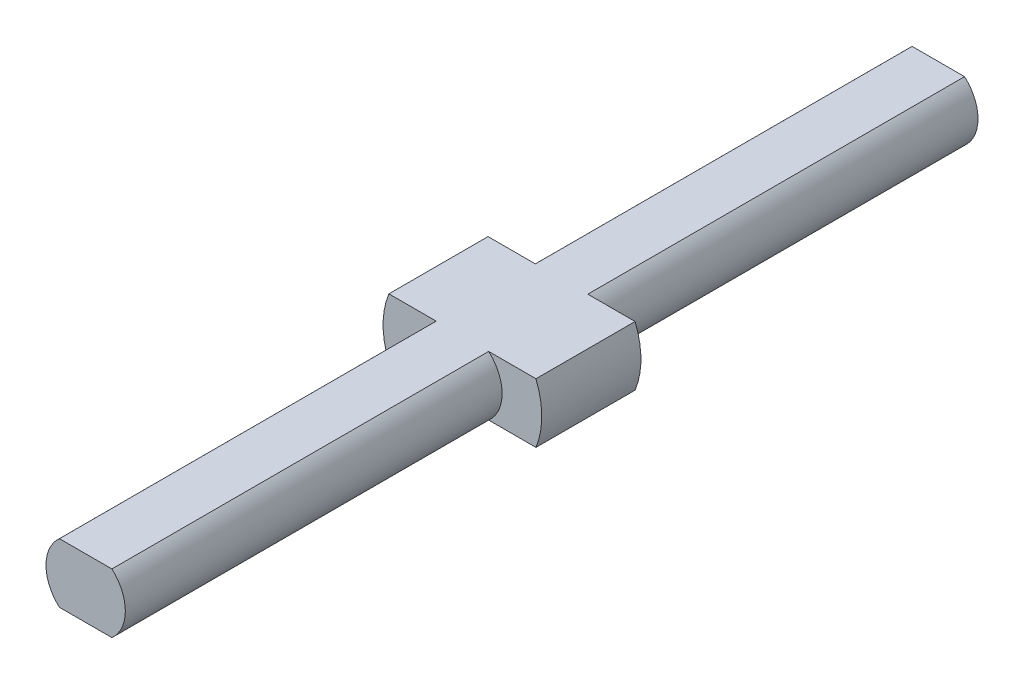
ISO-10303-21;
HEADER;
FILE_DESCRIPTION(('STEP AP214'),'2;1');
FILE_NAME('part.step','',(''),(''),'','','');
FILE_SCHEMA(('AUTOMOTIVE_DESIGN { 1 0 10303 214 1 1 1 1 }'));
ENDSEC;
DATA;
#1=APPLICATION_CONTEXT('core data for automotive mechanical design processes');
#2=APPLICATION_PROTOCOL_DEFINITION('international standard','automotive_design',2000,#1);
#3=PRODUCT_CONTEXT('',#1,'mechanical');
#4=PRODUCT('Part','Part','',(#3));
#5=PRODUCT_RELATED_PRODUCT_CATEGORY('part','',(#4));
#6=PRODUCT_DEFINITION_FORMATION('','',#4);
#7=PRODUCT_DEFINITION_CONTEXT('part definition',#1,'design');
#8=PRODUCT_DEFINITION('design','',#6,#7);
#9=PRODUCT_DEFINITION_SHAPE('','',#8);
#10=(LENGTH_UNIT() NAMED_UNIT(*) SI_UNIT(.MILLI.,.METRE.));
#11=(NAMED_UNIT(*) PLANE_ANGLE_UNIT() SI_UNIT($,.RADIAN.));
#12=(NAMED_UNIT(*) SI_UNIT($,.STERADIAN.) SOLID_ANGLE_UNIT());
#13=UNCERTAINTY_MEASURE_WITH_UNIT(LENGTH_MEASURE(1.E-05),#10,'distance_accuracy_value','');
#14=(GEOMETRIC_REPRESENTATION_CONTEXT(3) GLOBAL_UNCERTAINTY_ASSIGNED_CONTEXT((#13)) GLOBAL_UNIT_ASSIGNED_CONTEXT((#10,
#11,#12)) REPRESENTATION_CONTEXT('',''));
#15=CARTESIAN_POINT('',(0.,0.,0.));
#16=DIRECTION('',(0.,0.,1.));
#17=DIRECTION('',(1.,0.,0.));
#18=AXIS2_PLACEMENT_3D('',#15,#16,#17);
#19=CARTESIAN_POINT('',(0.,0.,-43.));
#20=DIRECTION('',(0.,0.,-1.));
#21=DIRECTION('',(-1.,0.,0.));
#22=AXIS2_PLACEMENT_3D('',#19,#20,#21);
#23=PLANE('',#22);
#24=DIRECTION('',(1.,0.,0.));
#25=VECTOR('',#24,1.);
#26=CARTESIAN_POINT('',(0.,3.,-43.));
#27=LINE('',#26,#25);
#28=CARTESIAN_POINT('',(-2.64575131106458,3.,-43.));
#29=VERTEX_POINT('',#28);
#30=CARTESIAN_POINT('',(2.64575131106458,3.,-43.));
#31=VERTEX_POINT('',#30);
#32=EDGE_CURVE('E134',#29,#31,#27,.T.);
#33=ORIENTED_EDGE('',*,*,#32,.T.);
#34=CARTESIAN_POINT('',(0.,0.,-43.));
#35=DIRECTION('',(0.,0.,1.));
#36=DIRECTION('',(1.,0.,0.));
#37=AXIS2_PLACEMENT_3D('',#34,#35,#36);
#38=CIRCLE('',#37,4.);
#39=CARTESIAN_POINT('',(2.64575131106458,-3.,-43.));
#40=VERTEX_POINT('',#39);
#41=EDGE_CURVE('E158',#40,#31,#38,.T.);
#42=ORIENTED_EDGE('',*,*,#41,.F.);
#43=DIRECTION('',(1.,0.,0.));
#44=VECTOR('',#43,1.);
#45=CARTESIAN_POINT('',(0.,-3.,-43.));
#46=LINE('',#45,#44);
#47=CARTESIAN_POINT('',(-2.64575131106458,-3.,-43.));
#48=VERTEX_POINT('',#47);
#49=EDGE_CURVE('E232',#48,#40,#46,.T.);
#50=ORIENTED_EDGE('',*,*,#49,.F.);
#51=EDGE_CURVE('E125',#29,#48,#38,.T.);
#52=ORIENTED_EDGE('',*,*,#51,.F.);
#53=EDGE_LOOP('',(#33,#42,#50,#52));
#54=FACE_BOUND('',#53,.T.);
#55=ADVANCED_FACE('F33',(#54),#23,.T.);
#56=CARTESIAN_POINT('',(0.,0.,43.));
#57=DIRECTION('',(0.,0.,1.));
#58=DIRECTION('',(1.,0.,0.));
#59=AXIS2_PLACEMENT_3D('',#56,#57,#58);
#60=CYLINDRICAL_SURFACE('',#59,4.);
#61=DIRECTION('',(0.,0.,1.));
#62=VECTOR('',#61,1.);
#63=CARTESIAN_POINT('',(2.64575131106458,3.,43.));
#64=LINE('',#63,#62);
#65=CARTESIAN_POINT('',(2.64575131106458,3.,-5.));
#66=VERTEX_POINT('',#65);
#67=EDGE_CURVE('E142',#66,#31,#64,.F.);
#68=ORIENTED_EDGE('',*,*,#67,.F.);
#69=CARTESIAN_POINT('',(0.,0.,-5.));
#70=DIRECTION('',(0.,0.,1.));
#71=DIRECTION('',(1.,0.,0.));
#72=AXIS2_PLACEMENT_3D('',#69,#70,#71);
#73=CIRCLE('',#72,3.99999999999999);
#74=CARTESIAN_POINT('',(2.64575131106458,-3.,-5.));
#75=VERTEX_POINT('',#74);
#76=EDGE_CURVE('E154',#75,#66,#73,.T.);
#77=ORIENTED_EDGE('',*,*,#76,.F.);
#78=DIRECTION('',(0.,0.,1.));
#79=VECTOR('',#78,1.);
#80=CARTESIAN_POINT('',(2.64575131106458,-3.,43.));
#81=LINE('',#80,#79);
#82=EDGE_CURVE('E194',#75,#40,#81,.F.);
#83=ORIENTED_EDGE('',*,*,#82,.T.);
#84=ORIENTED_EDGE('',*,*,#41,.T.);
#85=EDGE_LOOP('',(#68,#77,#83,#84));
#86=FACE_BOUND('',#85,.T.);
#87=ADVANCED_FACE('F237',(#86),#60,.T.);
#88=DIRECTION('',(0.,0.,1.));
#89=VECTOR('',#88,1.);
#90=CARTESIAN_POINT('',(-2.64575131106458,3.,43.));
#91=LINE('',#90,#89);
#92=CARTESIAN_POINT('',(-2.64575131106458,3.,-5.));
#93=VERTEX_POINT('',#92);
#94=EDGE_CURVE('E179',#29,#93,#91,.T.);
#95=ORIENTED_EDGE('',*,*,#94,.F.);
#96=ORIENTED_EDGE('',*,*,#51,.T.);
#97=DIRECTION('',(0.,0.,1.));
#98=VECTOR('',#97,1.);
#99=CARTESIAN_POINT('',(-2.64575131106458,-3.,43.));
#100=LINE('',#99,#98);
#101=CARTESIAN_POINT('',(-2.64575131106458,-3.,-5.));
#102=VERTEX_POINT('',#101);
#103=EDGE_CURVE('E181',#48,#102,#100,.T.);
#104=ORIENTED_EDGE('',*,*,#103,.T.);
#105=EDGE_CURVE('E157',#93,#102,#73,.T.);
#106=ORIENTED_EDGE('',*,*,#105,.F.);
#107=EDGE_LOOP('',(#95,#96,#104,#106));
#108=FACE_BOUND('',#107,.T.);
#109=ADVANCED_FACE('F178',(#108),#60,.T.);
#110=CARTESIAN_POINT('',(3.99999999999999,0.,-5.));
#111=DIRECTION('',(0.,0.,-1.));
#112=DIRECTION('',(-1.,0.,0.));
#113=AXIS2_PLACEMENT_3D('',#110,#111,#112);
#114=PLANE('',#113);
#115=DIRECTION('',(-1.,0.,0.));
#116=VECTOR('',#115,1.);
#117=CARTESIAN_POINT('',(3.99999999999999,3.,-5.));
#118=LINE('',#117,#116);
#119=CARTESIAN_POINT('',(7.41619848709566,3.,-5.));
#120=VERTEX_POINT('',#119);
#121=EDGE_CURVE('E203',#120,#66,#118,.T.);
#122=ORIENTED_EDGE('',*,*,#121,.F.);
#123=CARTESIAN_POINT('',(0.,0.,-5.));
#124=DIRECTION('',(0.,0.,1.));
#125=DIRECTION('',(1.,0.,0.));
#126=AXIS2_PLACEMENT_3D('',#123,#124,#125);
#127=CIRCLE('',#126,8.);
#128=CARTESIAN_POINT('',(7.41619848709566,-3.,-5.));
#129=VERTEX_POINT('',#128);
#130=EDGE_CURVE('E150',#129,#120,#127,.T.);
#131=ORIENTED_EDGE('',*,*,#130,.F.);
#132=DIRECTION('',(-1.,0.,0.));
#133=VECTOR('',#132,1.);
#134=CARTESIAN_POINT('',(3.99999999999999,-3.,-5.));
#135=LINE('',#134,#133);
#136=EDGE_CURVE('E188',#129,#75,#135,.T.);
#137=ORIENTED_EDGE('',*,*,#136,.T.);
#138=ORIENTED_EDGE('',*,*,#76,.T.);
#139=EDGE_LOOP('',(#122,#131,#137,#138));
#140=FACE_BOUND('',#139,.T.);
#141=ADVANCED_FACE('F245',(#140),#114,.T.);
#142=CARTESIAN_POINT('',(-7.41619848709566,3.,-5.));
#143=VERTEX_POINT('',#142);
#144=EDGE_CURVE('E174',#93,#143,#118,.T.);
#145=ORIENTED_EDGE('',*,*,#144,.F.);
#146=ORIENTED_EDGE('',*,*,#105,.T.);
#147=CARTESIAN_POINT('',(-7.41619848709566,-3.,-5.));
#148=VERTEX_POINT('',#147);
#149=EDGE_CURVE('E172',#102,#148,#135,.T.);
#150=ORIENTED_EDGE('',*,*,#149,.T.);
#151=EDGE_CURVE('E153',#143,#148,#127,.T.);
#152=ORIENTED_EDGE('',*,*,#151,.F.);
#153=EDGE_LOOP('',(#145,#146,#150,#152));
#154=FACE_BOUND('',#153,.T.);
#155=ADVANCED_FACE('F170',(#154),#114,.T.);
#156=CARTESIAN_POINT('',(0.,0.,43.));
#157=DIRECTION('',(0.,0.,1.));
#158=DIRECTION('',(1.,0.,0.));
#159=AXIS2_PLACEMENT_3D('',#156,#157,#158);
#160=CYLINDRICAL_SURFACE('',#159,8.);
#161=DIRECTION('',(0.,0.,1.));
#162=VECTOR('',#161,1.);
#163=CARTESIAN_POINT('',(7.41619848709566,3.,43.));
#164=LINE('',#163,#162);
#165=CARTESIAN_POINT('',(7.41619848709566,3.,5.));
#166=VERTEX_POINT('',#165);
#167=EDGE_CURVE('E206',#166,#120,#164,.F.);
#168=ORIENTED_EDGE('',*,*,#167,.F.);
#169=CARTESIAN_POINT('',(0.,0.,5.));
#170=DIRECTION('',(0.,0.,1.));
#171=DIRECTION('',(1.,0.,0.));
#172=AXIS2_PLACEMENT_3D('',#169,#170,#171);
#173=CIRCLE('',#172,8.);
#174=CARTESIAN_POINT('',(7.41619848709566,-3.,5.));
#175=VERTEX_POINT('',#174);
#176=EDGE_CURVE('E146',#175,#166,#173,.T.);
#177=ORIENTED_EDGE('',*,*,#176,.F.);
#178=DIRECTION('',(0.,0.,1.));
#179=VECTOR('',#178,1.);
#180=CARTESIAN_POINT('',(7.41619848709566,-3.,43.));
#181=LINE('',#180,#179);
#182=EDGE_CURVE('E191',#175,#129,#181,.F.);
#183=ORIENTED_EDGE('',*,*,#182,.T.);
#184=ORIENTED_EDGE('',*,*,#130,.T.);
#185=EDGE_LOOP('',(#168,#177,#183,#184));
#186=FACE_BOUND('',#185,.T.);
#187=ADVANCED_FACE('F216',(#186),#160,.T.);
#188=DIRECTION('',(0.,0.,1.));
#189=VECTOR('',#188,1.);
#190=CARTESIAN_POINT('',(-7.41619848709566,3.,43.));
#191=LINE('',#190,#189);
#192=CARTESIAN_POINT('',(-7.41619848709566,3.,5.));
#193=VERTEX_POINT('',#192);
#194=EDGE_CURVE('E199',#143,#193,#191,.T.);
#195=ORIENTED_EDGE('',*,*,#194,.F.);
#196=ORIENTED_EDGE('',*,*,#151,.T.);
#197=DIRECTION('',(0.,0.,1.));
#198=VECTOR('',#197,1.);
#199=CARTESIAN_POINT('',(-7.41619848709566,-3.,43.));
#200=LINE('',#199,#198);
#201=CARTESIAN_POINT('',(-7.41619848709566,-3.,5.));
#202=VERTEX_POINT('',#201);
#203=EDGE_CURVE('E186',#148,#202,#200,.T.);
#204=ORIENTED_EDGE('',*,*,#203,.T.);
#205=EDGE_CURVE('E149',#193,#202,#173,.T.);
#206=ORIENTED_EDGE('',*,*,#205,.F.);
#207=EDGE_LOOP('',(#195,#196,#204,#206));
#208=FACE_BOUND('',#207,.T.);
#209=ADVANCED_FACE('F227',(#208),#160,.T.);
#210=CARTESIAN_POINT('',(8.,0.,5.));
#211=DIRECTION('',(0.,0.,1.));
#212=DIRECTION('',(1.,0.,0.));
#213=AXIS2_PLACEMENT_3D('',#210,#211,#212);
#214=PLANE('',#213);
#215=DIRECTION('',(1.,0.,0.));
#216=VECTOR('',#215,1.);
#217=CARTESIAN_POINT('',(8.,3.,5.));
#218=LINE('',#217,#216);
#219=CARTESIAN_POINT('',(-2.64575131106458,3.,5.));
#220=VERTEX_POINT('',#219);
#221=EDGE_CURVE('E197',#193,#220,#218,.T.);
#222=ORIENTED_EDGE('',*,*,#221,.F.);
#223=ORIENTED_EDGE('',*,*,#205,.T.);
#224=DIRECTION('',(1.,0.,0.));
#225=VECTOR('',#224,1.);
#226=CARTESIAN_POINT('',(8.,-3.,5.));
#227=LINE('',#226,#225);
#228=CARTESIAN_POINT('',(-2.64575131106458,-3.,5.));
#229=VERTEX_POINT('',#228);
#230=EDGE_CURVE('E133',#202,#229,#227,.T.);
#231=ORIENTED_EDGE('',*,*,#230,.T.);
#232=CARTESIAN_POINT('',(0.,0.,5.));
#233=DIRECTION('',(0.,0.,1.));
#234=DIRECTION('',(1.,0.,0.));
#235=AXIS2_PLACEMENT_3D('',#232,#233,#234);
#236=CIRCLE('',#235,3.99999999999999);
#237=EDGE_CURVE('E132',#220,#229,#236,.T.);
#238=ORIENTED_EDGE('',*,*,#237,.F.);
#239=EDGE_LOOP('',(#222,#223,#231,#238));
#240=FACE_BOUND('',#239,.T.);
#241=ADVANCED_FACE('F229',(#240),#214,.T.);
#242=CARTESIAN_POINT('',(2.64575131106458,3.,5.));
#243=VERTEX_POINT('',#242);
#244=EDGE_CURVE('E200',#243,#166,#218,.T.);
#245=ORIENTED_EDGE('',*,*,#244,.F.);
#246=CARTESIAN_POINT('',(2.64575131106458,-3.,5.));
#247=VERTEX_POINT('',#246);
#248=EDGE_CURVE('E137',#247,#243,#236,.T.);
#249=ORIENTED_EDGE('',*,*,#248,.F.);
#250=EDGE_CURVE('E184',#247,#175,#227,.T.);
#251=ORIENTED_EDGE('',*,*,#250,.T.);
#252=ORIENTED_EDGE('',*,*,#176,.T.);
#253=EDGE_LOOP('',(#245,#249,#251,#252));
#254=FACE_BOUND('',#253,.T.);
#255=ADVANCED_FACE('F219',(#254),#214,.T.);
#256=CARTESIAN_POINT('',(0.,0.,43.));
#257=DIRECTION('',(0.,0.,1.));
#258=DIRECTION('',(1.,0.,0.));
#259=AXIS2_PLACEMENT_3D('',#256,#257,#258);
#260=CYLINDRICAL_SURFACE('',#259,4.);
#261=DIRECTION('',(0.,0.,1.));
#262=VECTOR('',#261,1.);
#263=CARTESIAN_POINT('',(2.64575131106458,3.,43.));
#264=LINE('',#263,#262);
#265=CARTESIAN_POINT('',(2.64575131106459,3.,43.));
#266=VERTEX_POINT('',#265);
#267=EDGE_CURVE('E205',#266,#243,#264,.F.);
#268=ORIENTED_EDGE('',*,*,#267,.F.);
#269=CARTESIAN_POINT('',(0.,0.,43.));
#270=DIRECTION('',(0.,0.,1.));
#271=DIRECTION('',(1.,0.,0.));
#272=AXIS2_PLACEMENT_3D('',#269,#270,#271);
#273=CIRCLE('',#272,4.);
#274=CARTESIAN_POINT('',(2.64575131106459,-3.,43.));
#275=VERTEX_POINT('',#274);
#276=EDGE_CURVE('E138',#275,#266,#273,.T.);
#277=ORIENTED_EDGE('',*,*,#276,.F.);
#278=DIRECTION('',(0.,0.,1.));
#279=VECTOR('',#278,1.);
#280=CARTESIAN_POINT('',(2.64575131106458,-3.,43.));
#281=LINE('',#280,#279);
#282=EDGE_CURVE('E47',#275,#247,#281,.F.);
#283=ORIENTED_EDGE('',*,*,#282,.T.);
#284=ORIENTED_EDGE('',*,*,#248,.T.);
#285=EDGE_LOOP('',(#268,#277,#283,#284));
#286=FACE_BOUND('',#285,.T.);
#287=ADVANCED_FACE('F254',(#286),#260,.T.);
#288=DIRECTION('',(0.,0.,1.));
#289=VECTOR('',#288,1.);
#290=CARTESIAN_POINT('',(-2.64575131106458,3.,43.));
#291=LINE('',#290,#289);
#292=CARTESIAN_POINT('',(-2.64575131106459,3.,43.));
#293=VERTEX_POINT('',#292);
#294=EDGE_CURVE('E54',#220,#293,#291,.T.);
#295=ORIENTED_EDGE('',*,*,#294,.F.);
#296=ORIENTED_EDGE('',*,*,#237,.T.);
#297=DIRECTION('',(0.,0.,1.));
#298=VECTOR('',#297,1.);
#299=CARTESIAN_POINT('',(-2.64575131106458,-3.,43.));
#300=LINE('',#299,#298);
#301=CARTESIAN_POINT('',(-2.64575131106459,-3.,43.));
#302=VERTEX_POINT('',#301);
#303=EDGE_CURVE('E119',#229,#302,#300,.T.);
#304=ORIENTED_EDGE('',*,*,#303,.T.);
#305=EDGE_CURVE('E130',#293,#302,#273,.T.);
#306=ORIENTED_EDGE('',*,*,#305,.F.);
#307=EDGE_LOOP('',(#295,#296,#304,#306));
#308=FACE_BOUND('',#307,.T.);
#309=ADVANCED_FACE('F129',(#308),#260,.T.);
#310=CARTESIAN_POINT('',(4.,0.,43.));
#311=DIRECTION('',(0.,0.,1.));
#312=DIRECTION('',(1.,0.,0.));
#313=AXIS2_PLACEMENT_3D('',#310,#311,#312);
#314=PLANE('',#313);
#315=DIRECTION('',(1.,0.,0.));
#316=VECTOR('',#315,1.);
#317=CARTESIAN_POINT('',(4.,3.,43.));
#318=LINE('',#317,#316);
#319=EDGE_CURVE('E11',#293,#266,#318,.T.);
#320=ORIENTED_EDGE('',*,*,#319,.F.);
#321=ORIENTED_EDGE('',*,*,#305,.T.);
#322=DIRECTION('',(1.,0.,0.));
#323=VECTOR('',#322,1.);
#324=CARTESIAN_POINT('',(4.,-3.,43.));
#325=LINE('',#324,#323);
#326=EDGE_CURVE('E40',#302,#275,#325,.T.);
#327=ORIENTED_EDGE('',*,*,#326,.T.);
#328=ORIENTED_EDGE('',*,*,#276,.T.);
#329=EDGE_LOOP('',(#320,#321,#327,#328));
#330=FACE_BOUND('',#329,.T.);
#331=ADVANCED_FACE('F136',(#330),#314,.T.);
#332=CARTESIAN_POINT('',(0.,-3.,-43.));
#333=DIRECTION('',(0.,-1.,0.));
#334=DIRECTION('',(0.,0.,-1.));
#335=AXIS2_PLACEMENT_3D('',#332,#333,#334);
#336=PLANE('',#335);
#337=ORIENTED_EDGE('',*,*,#136,.F.);
#338=ORIENTED_EDGE('',*,*,#182,.F.);
#339=ORIENTED_EDGE('',*,*,#250,.F.);
#340=ORIENTED_EDGE('',*,*,#282,.F.);
#341=ORIENTED_EDGE('',*,*,#326,.F.);
#342=ORIENTED_EDGE('',*,*,#303,.F.);
#343=ORIENTED_EDGE('',*,*,#230,.F.);
#344=ORIENTED_EDGE('',*,*,#203,.F.);
#345=ORIENTED_EDGE('',*,*,#149,.F.);
#346=ORIENTED_EDGE('',*,*,#103,.F.);
#347=ORIENTED_EDGE('',*,*,#49,.T.);
#348=ORIENTED_EDGE('',*,*,#82,.F.);
#349=EDGE_LOOP('',(#337,#338,#339,#340,#341,#342,#343,#344,#345,#346,#347,#348));
#350=FACE_BOUND('',#349,.T.);
#351=ADVANCED_FACE('F118',(#350),#336,.T.);
#352=CARTESIAN_POINT('',(0.,3.,-43.));
#353=DIRECTION('',(0.,-1.,0.));
#354=DIRECTION('',(0.,0.,-1.));
#355=AXIS2_PLACEMENT_3D('',#352,#353,#354);
#356=PLANE('',#355);
#357=ORIENTED_EDGE('',*,*,#67,.T.);
#358=ORIENTED_EDGE('',*,*,#32,.F.);
#359=ORIENTED_EDGE('',*,*,#94,.T.);
#360=ORIENTED_EDGE('',*,*,#144,.T.);
#361=ORIENTED_EDGE('',*,*,#194,.T.);
#362=ORIENTED_EDGE('',*,*,#221,.T.);
#363=ORIENTED_EDGE('',*,*,#294,.T.);
#364=ORIENTED_EDGE('',*,*,#319,.T.);
#365=ORIENTED_EDGE('',*,*,#267,.T.);
#366=ORIENTED_EDGE('',*,*,#244,.T.);
#367=ORIENTED_EDGE('',*,*,#167,.T.);
#368=ORIENTED_EDGE('',*,*,#121,.T.);
#369=EDGE_LOOP('',(#357,#358,#359,#360,#361,#362,#363,#364,#365,#366,#367,#368));
#370=FACE_BOUND('',#369,.T.);
#371=ADVANCED_FACE('F210',(#370),#356,.F.);
#372=CLOSED_SHELL('',(#55,#87,#109,#141,#155,#187,#209,#241,#255,#287,#309,#331,#351,#371));
#373=MANIFOLD_SOLID_BREP('B2',#372);
#374=ADVANCED_BREP_SHAPE_REPRESENTATION('',(#18,#373),#14);
#375=SHAPE_DEFINITION_REPRESENTATION(#9,#374);
ENDSEC;
END-ISO-10303-21;
